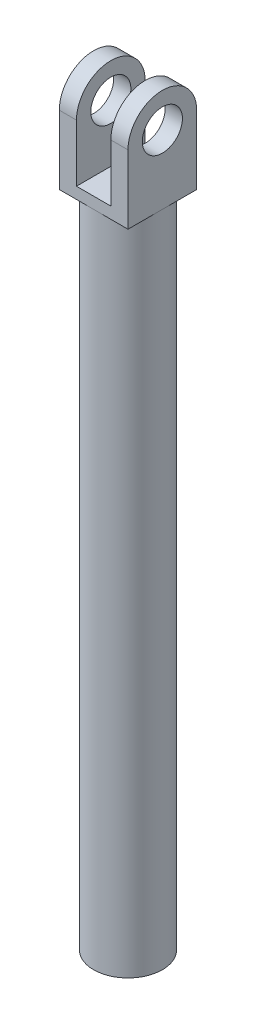
ISO-10303-21;
HEADER;
FILE_DESCRIPTION(('STEP AP214'),'2;1');
FILE_NAME('part.step','',(''),(''),'','','');
FILE_SCHEMA(('AUTOMOTIVE_DESIGN { 1 0 10303 214 1 1 1 1 }'));
ENDSEC;
DATA;
#1=APPLICATION_CONTEXT('core data for automotive mechanical design processes');
#2=APPLICATION_PROTOCOL_DEFINITION('international standard','automotive_design',2000,#1);
#3=PRODUCT_CONTEXT('',#1,'mechanical');
#4=PRODUCT('Part','Part','',(#3));
#5=PRODUCT_RELATED_PRODUCT_CATEGORY('part','',(#4));
#6=PRODUCT_DEFINITION_FORMATION('','',#4);
#7=PRODUCT_DEFINITION_CONTEXT('part definition',#1,'design');
#8=PRODUCT_DEFINITION('design','',#6,#7);
#9=PRODUCT_DEFINITION_SHAPE('','',#8);
#10=(LENGTH_UNIT() NAMED_UNIT(*) SI_UNIT(.MILLI.,.METRE.));
#11=(NAMED_UNIT(*) PLANE_ANGLE_UNIT() SI_UNIT($,.RADIAN.));
#12=(NAMED_UNIT(*) SI_UNIT($,.STERADIAN.) SOLID_ANGLE_UNIT());
#13=UNCERTAINTY_MEASURE_WITH_UNIT(LENGTH_MEASURE(1.E-05),#10,'distance_accuracy_value','');
#14=(GEOMETRIC_REPRESENTATION_CONTEXT(3) GLOBAL_UNCERTAINTY_ASSIGNED_CONTEXT((#13)) GLOBAL_UNIT_ASSIGNED_CONTEXT((#10,
#11,#12)) REPRESENTATION_CONTEXT('',''));
#15=CARTESIAN_POINT('',(0.,0.,0.));
#16=DIRECTION('',(0.,0.,1.));
#17=DIRECTION('',(1.,0.,0.));
#18=AXIS2_PLACEMENT_3D('',#15,#16,#17);
#19=CARTESIAN_POINT('',(3.,127.,0.));
#20=DIRECTION('',(1.,0.,0.));
#21=DIRECTION('',(0.,0.,-1.));
#22=AXIS2_PLACEMENT_3D('',#19,#20,#21);
#23=CYLINDRICAL_SURFACE('',#22,3.5);
#24=CARTESIAN_POINT('',(3.,127.,0.));
#25=DIRECTION('',(1.,0.,0.));
#26=DIRECTION('',(0.,0.,-1.));
#27=AXIS2_PLACEMENT_3D('',#24,#25,#26);
#28=CIRCLE('',#27,3.5);
#29=CARTESIAN_POINT('',(3.,127.,-3.5));
#30=VERTEX_POINT('',#29);
#31=EDGE_CURVE('E224',#30,#30,#28,.T.);
#32=ORIENTED_EDGE('',*,*,#31,.F.);
#33=EDGE_LOOP('',(#32));
#34=FACE_BOUND('',#33,.T.);
#35=CARTESIAN_POINT('',(6.,127.,0.));
#36=DIRECTION('',(1.,0.,0.));
#37=DIRECTION('',(0.,0.,-1.));
#38=AXIS2_PLACEMENT_3D('',#35,#36,#37);
#39=CIRCLE('',#38,3.5);
#40=CARTESIAN_POINT('',(6.,127.,-3.5));
#41=VERTEX_POINT('',#40);
#42=EDGE_CURVE('E188',#41,#41,#39,.T.);
#43=ORIENTED_EDGE('',*,*,#42,.T.);
#44=EDGE_LOOP('',(#43));
#45=FACE_BOUND('',#44,.T.);
#46=ADVANCED_FACE('F17',(#34,#45),#23,.F.);
#47=CARTESIAN_POINT('',(-6.072,0.,-6.072));
#48=DIRECTION('',(0.,1.,0.));
#49=DIRECTION('',(0.,0.,1.));
#50=AXIS2_PLACEMENT_3D('',#47,#48,#49);
#51=PLANE('',#50);
#52=CARTESIAN_POINT('',(0.,0.,0.));
#53=DIRECTION('',(0.,1.,0.));
#54=DIRECTION('',(0.,0.,1.));
#55=AXIS2_PLACEMENT_3D('',#52,#53,#54);
#56=CIRCLE('',#55,6.);
#57=CARTESIAN_POINT('',(0.,0.,6.));
#58=VERTEX_POINT('',#57);
#59=EDGE_CURVE('E176',#58,#58,#56,.F.);
#60=ORIENTED_EDGE('',*,*,#59,.T.);
#61=EDGE_LOOP('',(#60));
#62=FACE_BOUND('',#61,.T.);
#63=ADVANCED_FACE('F311',(#62),#51,.F.);
#64=CARTESIAN_POINT('',(-0.036,115.,-6.));
#65=DIRECTION('',(0.,1.,0.));
#66=DIRECTION('',(0.,0.,1.));
#67=AXIS2_PLACEMENT_3D('',#64,#65,#66);
#68=PLANE('',#67);
#69=DIRECTION('',(1.,0.,0.));
#70=VECTOR('',#69,1.);
#71=CARTESIAN_POINT('',(0.,115.,-6.));
#72=LINE('',#71,#70);
#73=CARTESIAN_POINT('',(-1.23062060560279E-09,115.,-6.));
#74=VERTEX_POINT('',#73);
#75=CARTESIAN_POINT('',(6.,115.,-6.));
#76=VERTEX_POINT('',#75);
#77=EDGE_CURVE('E126',#74,#76,#72,.T.);
#78=ORIENTED_EDGE('',*,*,#77,.T.);
#79=DIRECTION('',(0.,0.,1.));
#80=VECTOR('',#79,1.);
#81=CARTESIAN_POINT('',(6.,115.,0.));
#82=LINE('',#81,#80);
#83=CARTESIAN_POINT('',(6.,115.,-6.15309619412179E-10));
#84=VERTEX_POINT('',#83);
#85=EDGE_CURVE('E208',#76,#84,#82,.T.);
#86=ORIENTED_EDGE('',*,*,#85,.T.);
#87=CARTESIAN_POINT('',(0.,115.,0.));
#88=DIRECTION('',(0.,1.,0.));
#89=DIRECTION('',(0.,0.,1.));
#90=AXIS2_PLACEMENT_3D('',#87,#88,#89);
#91=CIRCLE('',#90,6.);
#92=EDGE_CURVE('E21',#74,#84,#91,.F.);
#93=ORIENTED_EDGE('',*,*,#92,.F.);
#94=EDGE_LOOP('',(#78,#86,#93));
#95=FACE_BOUND('',#94,.T.);
#96=ADVANCED_FACE('F231',(#95),#68,.F.);
#97=CARTESIAN_POINT('',(3.,117.,-6.));
#98=DIRECTION('',(-1.,0.,0.));
#99=DIRECTION('',(0.,0.,1.));
#100=AXIS2_PLACEMENT_3D('',#97,#98,#99);
#101=PLANE('',#100);
#102=ORIENTED_EDGE('',*,*,#31,.T.);
#103=EDGE_LOOP('',(#102));
#104=FACE_BOUND('',#103,.T.);
#105=DIRECTION('',(0.,1.,0.));
#106=VECTOR('',#105,1.);
#107=CARTESIAN_POINT('',(3.,121.,6.));
#108=LINE('',#107,#106);
#109=CARTESIAN_POINT('',(3.,117.000000002667,6.));
#110=VERTEX_POINT('',#109);
#111=CARTESIAN_POINT('',(3.,127.,6.));
#112=VERTEX_POINT('',#111);
#113=EDGE_CURVE('E150',#110,#112,#108,.T.);
#114=ORIENTED_EDGE('',*,*,#113,.T.);
#115=CARTESIAN_POINT('',(3.,127.,0.));
#116=DIRECTION('',(1.,0.,0.));
#117=DIRECTION('',(0.,0.,-1.));
#118=AXIS2_PLACEMENT_3D('',#115,#116,#117);
#119=CIRCLE('',#118,6.);
#120=CARTESIAN_POINT('',(3.,127.,-6.));
#121=VERTEX_POINT('',#120);
#122=EDGE_CURVE('E223',#112,#121,#119,.F.);
#123=ORIENTED_EDGE('',*,*,#122,.T.);
#124=DIRECTION('',(0.,-1.,0.));
#125=VECTOR('',#124,1.);
#126=CARTESIAN_POINT('',(3.,121.,-6.));
#127=LINE('',#126,#125);
#128=CARTESIAN_POINT('',(3.,117.000000002,-6.));
#129=VERTEX_POINT('',#128);
#130=EDGE_CURVE('E154',#121,#129,#127,.T.);
#131=ORIENTED_EDGE('',*,*,#130,.T.);
#132=DIRECTION('',(0.,0.,-1.));
#133=VECTOR('',#132,1.);
#134=CARTESIAN_POINT('',(3.,117.,0.));
#135=LINE('',#134,#133);
#136=EDGE_CURVE('E167',#110,#129,#135,.T.);
#137=ORIENTED_EDGE('',*,*,#136,.F.);
#138=EDGE_LOOP('',(#114,#123,#131,#137));
#139=FACE_BOUND('',#138,.T.);
#140=ADVANCED_FACE('F246',(#104,#139),#101,.T.);
#141=CARTESIAN_POINT('',(3.,127.,0.));
#142=DIRECTION('',(1.,0.,0.));
#143=DIRECTION('',(0.,0.,-1.));
#144=AXIS2_PLACEMENT_3D('',#141,#142,#143);
#145=CYLINDRICAL_SURFACE('',#144,6.);
#146=DIRECTION('',(-1.,0.,0.));
#147=VECTOR('',#146,1.);
#148=CARTESIAN_POINT('',(0.,127.,-6.));
#149=LINE('',#148,#147);
#150=CARTESIAN_POINT('',(6.,127.,-6.));
#151=VERTEX_POINT('',#150);
#152=EDGE_CURVE('E199',#151,#121,#149,.T.);
#153=ORIENTED_EDGE('',*,*,#152,.T.);
#154=ORIENTED_EDGE('',*,*,#122,.F.);
#155=DIRECTION('',(1.,0.,0.));
#156=VECTOR('',#155,1.);
#157=CARTESIAN_POINT('',(0.,127.,6.));
#158=LINE('',#157,#156);
#159=CARTESIAN_POINT('',(6.,127.,6.));
#160=VERTEX_POINT('',#159);
#161=EDGE_CURVE('E181',#112,#160,#158,.T.);
#162=ORIENTED_EDGE('',*,*,#161,.T.);
#163=CARTESIAN_POINT('',(6.,127.,0.));
#164=DIRECTION('',(1.,0.,0.));
#165=DIRECTION('',(0.,0.,-1.));
#166=AXIS2_PLACEMENT_3D('',#163,#164,#165);
#167=CIRCLE('',#166,6.);
#168=EDGE_CURVE('E210',#160,#151,#167,.F.);
#169=ORIENTED_EDGE('',*,*,#168,.T.);
#170=EDGE_LOOP('',(#153,#154,#162,#169));
#171=FACE_BOUND('',#170,.T.);
#172=ADVANCED_FACE('F242',(#171),#145,.T.);
#173=CARTESIAN_POINT('',(6.,115.,-6.));
#174=DIRECTION('',(-1.,0.,0.));
#175=DIRECTION('',(0.,0.,1.));
#176=AXIS2_PLACEMENT_3D('',#173,#174,#175);
#177=PLANE('',#176);
#178=ORIENTED_EDGE('',*,*,#42,.F.);
#179=EDGE_LOOP('',(#178));
#180=FACE_BOUND('',#179,.T.);
#181=ORIENTED_EDGE('',*,*,#85,.F.);
#182=DIRECTION('',(0.,1.,0.));
#183=VECTOR('',#182,1.);
#184=CARTESIAN_POINT('',(6.,121.,-6.));
#185=LINE('',#184,#183);
#186=EDGE_CURVE('E166',#76,#151,#185,.T.);
#187=ORIENTED_EDGE('',*,*,#186,.T.);
#188=ORIENTED_EDGE('',*,*,#168,.F.);
#189=DIRECTION('',(0.,-1.,0.));
#190=VECTOR('',#189,1.);
#191=CARTESIAN_POINT('',(6.,121.,6.));
#192=LINE('',#191,#190);
#193=CARTESIAN_POINT('',(6.,115.,6.));
#194=VERTEX_POINT('',#193);
#195=EDGE_CURVE('E172',#160,#194,#192,.T.);
#196=ORIENTED_EDGE('',*,*,#195,.T.);
#197=DIRECTION('',(0.,0.,-1.));
#198=VECTOR('',#197,1.);
#199=CARTESIAN_POINT('',(6.,115.,2.982));
#200=LINE('',#199,#198);
#201=EDGE_CURVE('E184',#194,#84,#200,.T.);
#202=ORIENTED_EDGE('',*,*,#201,.T.);
#203=EDGE_LOOP('',(#181,#187,#188,#196,#202));
#204=FACE_BOUND('',#203,.T.);
#205=ADVANCED_FACE('F237',(#180,#204),#177,.F.);
#206=CARTESIAN_POINT('',(-0.036,115.,-0.036));
#207=DIRECTION('',(0.,1.,0.));
#208=DIRECTION('',(0.,0.,1.));
#209=AXIS2_PLACEMENT_3D('',#206,#207,#208);
#210=PLANE('',#209);
#211=ORIENTED_EDGE('',*,*,#201,.F.);
#212=DIRECTION('',(-1.,0.,0.));
#213=VECTOR('',#212,1.);
#214=CARTESIAN_POINT('',(0.,115.,6.));
#215=LINE('',#214,#213);
#216=CARTESIAN_POINT('',(-5.38761770572398E-10,115.,6.));
#217=VERTEX_POINT('',#216);
#218=EDGE_CURVE('E147',#194,#217,#215,.T.);
#219=ORIENTED_EDGE('',*,*,#218,.T.);
#220=CARTESIAN_POINT('',(0.,115.,0.));
#221=DIRECTION('',(0.,1.,0.));
#222=DIRECTION('',(0.,0.,1.));
#223=AXIS2_PLACEMENT_3D('',#220,#221,#222);
#224=CIRCLE('',#223,6.);
#225=EDGE_CURVE('E187',#84,#217,#224,.F.);
#226=ORIENTED_EDGE('',*,*,#225,.F.);
#227=EDGE_LOOP('',(#211,#219,#226));
#228=FACE_BOUND('',#227,.T.);
#229=ADVANCED_FACE('F234',(#228),#210,.F.);
#230=CARTESIAN_POINT('',(0.,0.,0.));
#231=DIRECTION('',(0.,1.,0.));
#232=DIRECTION('',(0.,0.,1.));
#233=AXIS2_PLACEMENT_3D('',#230,#231,#232);
#234=CYLINDRICAL_SURFACE('',#233,6.);
#235=ORIENTED_EDGE('',*,*,#59,.F.);
#236=EDGE_LOOP('',(#235));
#237=FACE_BOUND('',#236,.T.);
#238=ORIENTED_EDGE('',*,*,#225,.T.);
#239=CARTESIAN_POINT('',(0.,115.,0.));
#240=DIRECTION('',(0.,1.,0.));
#241=DIRECTION('',(0.,0.,1.));
#242=AXIS2_PLACEMENT_3D('',#239,#240,#241);
#243=CIRCLE('',#242,6.);
#244=CARTESIAN_POINT('',(-6.,115.,-1.15406939158313E-09));
#245=VERTEX_POINT('',#244);
#246=EDGE_CURVE('E127',#217,#245,#243,.F.);
#247=ORIENTED_EDGE('',*,*,#246,.T.);
#248=CARTESIAN_POINT('',(0.,115.,0.));
#249=DIRECTION('',(0.,1.,0.));
#250=DIRECTION('',(0.,0.,1.));
#251=AXIS2_PLACEMENT_3D('',#248,#249,#250);
#252=CIRCLE('',#251,6.);
#253=EDGE_CURVE('E36',#245,#74,#252,.F.);
#254=ORIENTED_EDGE('',*,*,#253,.T.);
#255=ORIENTED_EDGE('',*,*,#92,.T.);
#256=EDGE_LOOP('',(#238,#247,#254,#255));
#257=FACE_BOUND('',#256,.T.);
#258=ADVANCED_FACE('F229',(#237,#257),#234,.T.);
#259=CARTESIAN_POINT('',(-3.,117.,-6.));
#260=DIRECTION('',(0.,1.,0.));
#261=DIRECTION('',(0.,0.,1.));
#262=AXIS2_PLACEMENT_3D('',#259,#260,#261);
#263=PLANE('',#262);
#264=ORIENTED_EDGE('',*,*,#136,.T.);
#265=DIRECTION('',(-1.,0.,0.));
#266=VECTOR('',#265,1.);
#267=CARTESIAN_POINT('',(0.,117.000000004,-6.));
#268=LINE('',#267,#266);
#269=CARTESIAN_POINT('',(-3.,117.000000001333,-6.));
#270=VERTEX_POINT('',#269);
#271=EDGE_CURVE('E151',#129,#270,#268,.T.);
#272=ORIENTED_EDGE('',*,*,#271,.T.);
#273=DIRECTION('',(0.,0.,-1.));
#274=VECTOR('',#273,1.);
#275=CARTESIAN_POINT('',(-3.,117.,0.));
#276=LINE('',#275,#274);
#277=CARTESIAN_POINT('',(-3.,117.000000001333,6.));
#278=VERTEX_POINT('',#277);
#279=EDGE_CURVE('E157',#278,#270,#276,.T.);
#280=ORIENTED_EDGE('',*,*,#279,.F.);
#281=DIRECTION('',(1.,0.,0.));
#282=VECTOR('',#281,1.);
#283=CARTESIAN_POINT('',(0.,117.000000004,6.));
#284=LINE('',#283,#282);
#285=EDGE_CURVE('E85',#278,#110,#284,.T.);
#286=ORIENTED_EDGE('',*,*,#285,.T.);
#287=EDGE_LOOP('',(#264,#272,#280,#286));
#288=FACE_BOUND('',#287,.T.);
#289=ADVANCED_FACE('F251',(#288),#263,.T.);
#290=CARTESIAN_POINT('',(-6.,115.,-6.));
#291=DIRECTION('',(0.,0.,1.));
#292=DIRECTION('',(1.,0.,0.));
#293=AXIS2_PLACEMENT_3D('',#290,#291,#292);
#294=PLANE('',#293);
#295=DIRECTION('',(0.,1.,0.));
#296=VECTOR('',#295,1.);
#297=CARTESIAN_POINT('',(-6.,124.054,-6.));
#298=LINE('',#297,#296);
#299=CARTESIAN_POINT('',(-6.,115.,-6.));
#300=VERTEX_POINT('',#299);
#301=CARTESIAN_POINT('',(-6.,126.999999998769,-6.));
#302=VERTEX_POINT('',#301);
#303=EDGE_CURVE('E113',#300,#302,#298,.T.);
#304=ORIENTED_EDGE('',*,*,#303,.T.);
#305=DIRECTION('',(-1.,0.,0.));
#306=VECTOR('',#305,1.);
#307=CARTESIAN_POINT('',(-4.5,126.999999997539,-6.));
#308=LINE('',#307,#306);
#309=CARTESIAN_POINT('',(-3.,126.999999998769,-6.));
#310=VERTEX_POINT('',#309);
#311=EDGE_CURVE('E148',#302,#310,#308,.F.);
#312=ORIENTED_EDGE('',*,*,#311,.T.);
#313=DIRECTION('',(0.,1.,0.));
#314=VECTOR('',#313,1.);
#315=CARTESIAN_POINT('',(-3.,125.048,-6.));
#316=LINE('',#315,#314);
#317=EDGE_CURVE('E106',#270,#310,#316,.T.);
#318=ORIENTED_EDGE('',*,*,#317,.F.);
#319=ORIENTED_EDGE('',*,*,#271,.F.);
#320=ORIENTED_EDGE('',*,*,#130,.F.);
#321=ORIENTED_EDGE('',*,*,#152,.F.);
#322=ORIENTED_EDGE('',*,*,#186,.F.);
#323=ORIENTED_EDGE('',*,*,#77,.F.);
#324=DIRECTION('',(-1.,0.,0.));
#325=VECTOR('',#324,1.);
#326=CARTESIAN_POINT('',(-2.982,115.,-6.));
#327=LINE('',#326,#325);
#328=EDGE_CURVE('E123',#74,#300,#327,.T.);
#329=ORIENTED_EDGE('',*,*,#328,.T.);
#330=EDGE_LOOP('',(#304,#312,#318,#319,#320,#321,#322,#323,#329));
#331=FACE_BOUND('',#330,.T.);
#332=ADVANCED_FACE('F124',(#331),#294,.F.);
#333=CARTESIAN_POINT('',(-3.,127.,0.));
#334=DIRECTION('',(-1.,0.,0.));
#335=DIRECTION('',(0.,0.,1.));
#336=AXIS2_PLACEMENT_3D('',#333,#334,#335);
#337=CYLINDRICAL_SURFACE('',#336,6.);
#338=DIRECTION('',(1.,0.,0.));
#339=VECTOR('',#338,1.);
#340=CARTESIAN_POINT('',(0.,127.,6.));
#341=LINE('',#340,#339);
#342=CARTESIAN_POINT('',(-6.,127.,6.));
#343=VERTEX_POINT('',#342);
#344=CARTESIAN_POINT('',(-3.,127.,6.));
#345=VERTEX_POINT('',#344);
#346=EDGE_CURVE('E76',#343,#345,#341,.T.);
#347=ORIENTED_EDGE('',*,*,#346,.T.);
#348=CARTESIAN_POINT('',(-3.,127.,0.));
#349=DIRECTION('',(-1.,0.,0.));
#350=DIRECTION('',(0.,0.,1.));
#351=AXIS2_PLACEMENT_3D('',#348,#349,#350);
#352=CIRCLE('',#351,6.);
#353=EDGE_CURVE('E121',#310,#345,#352,.F.);
#354=ORIENTED_EDGE('',*,*,#353,.F.);
#355=ORIENTED_EDGE('',*,*,#311,.F.);
#356=CARTESIAN_POINT('',(-6.,127.,0.));
#357=DIRECTION('',(-1.,0.,0.));
#358=DIRECTION('',(0.,0.,1.));
#359=AXIS2_PLACEMENT_3D('',#356,#357,#358);
#360=CIRCLE('',#359,6.);
#361=EDGE_CURVE('E119',#302,#343,#360,.F.);
#362=ORIENTED_EDGE('',*,*,#361,.T.);
#363=EDGE_LOOP('',(#347,#354,#355,#362));
#364=FACE_BOUND('',#363,.T.);
#365=ADVANCED_FACE('F267',(#364),#337,.T.);
#366=CARTESIAN_POINT('',(6.,115.,6.));
#367=DIRECTION('',(0.,0.,-1.));
#368=DIRECTION('',(-1.,0.,0.));
#369=AXIS2_PLACEMENT_3D('',#366,#367,#368);
#370=PLANE('',#369);
#371=DIRECTION('',(0.,-1.,0.));
#372=VECTOR('',#371,1.);
#373=CARTESIAN_POINT('',(-3.,125.048,6.));
#374=LINE('',#373,#372);
#375=EDGE_CURVE('E159',#345,#278,#374,.T.);
#376=ORIENTED_EDGE('',*,*,#375,.F.);
#377=ORIENTED_EDGE('',*,*,#346,.F.);
#378=DIRECTION('',(0.,-1.,0.));
#379=VECTOR('',#378,1.);
#380=CARTESIAN_POINT('',(-6.,124.054,6.));
#381=LINE('',#380,#379);
#382=CARTESIAN_POINT('',(-6.,115.,6.));
#383=VERTEX_POINT('',#382);
#384=EDGE_CURVE('E134',#343,#383,#381,.T.);
#385=ORIENTED_EDGE('',*,*,#384,.T.);
#386=DIRECTION('',(1.,0.,0.));
#387=VECTOR('',#386,1.);
#388=CARTESIAN_POINT('',(-2.982,115.,6.));
#389=LINE('',#388,#387);
#390=EDGE_CURVE('E141',#383,#217,#389,.T.);
#391=ORIENTED_EDGE('',*,*,#390,.T.);
#392=ORIENTED_EDGE('',*,*,#218,.F.);
#393=ORIENTED_EDGE('',*,*,#195,.F.);
#394=ORIENTED_EDGE('',*,*,#161,.F.);
#395=ORIENTED_EDGE('',*,*,#113,.F.);
#396=ORIENTED_EDGE('',*,*,#285,.F.);
#397=EDGE_LOOP('',(#376,#377,#385,#391,#392,#393,#394,#395,#396));
#398=FACE_BOUND('',#397,.T.);
#399=ADVANCED_FACE('F240',(#398),#370,.F.);
#400=CARTESIAN_POINT('',(-6.,115.,-0.036));
#401=DIRECTION('',(0.,1.,0.));
#402=DIRECTION('',(0.,0.,1.));
#403=AXIS2_PLACEMENT_3D('',#400,#401,#402);
#404=PLANE('',#403);
#405=ORIENTED_EDGE('',*,*,#390,.F.);
#406=DIRECTION('',(0.,0.,-1.));
#407=VECTOR('',#406,1.);
#408=CARTESIAN_POINT('',(-6.,115.,0.));
#409=LINE('',#408,#407);
#410=EDGE_CURVE('E130',#383,#245,#409,.T.);
#411=ORIENTED_EDGE('',*,*,#410,.T.);
#412=ORIENTED_EDGE('',*,*,#246,.F.);
#413=EDGE_LOOP('',(#405,#411,#412));
#414=FACE_BOUND('',#413,.T.);
#415=ADVANCED_FACE('F275',(#414),#404,.F.);
#416=CARTESIAN_POINT('',(-6.,115.,-6.));
#417=DIRECTION('',(0.,1.,0.));
#418=DIRECTION('',(0.,0.,1.));
#419=AXIS2_PLACEMENT_3D('',#416,#417,#418);
#420=PLANE('',#419);
#421=DIRECTION('',(0.,0.,-1.));
#422=VECTOR('',#421,1.);
#423=CARTESIAN_POINT('',(-6.,115.,0.));
#424=LINE('',#423,#422);
#425=EDGE_CURVE('E116',#245,#300,#424,.T.);
#426=ORIENTED_EDGE('',*,*,#425,.T.);
#427=ORIENTED_EDGE('',*,*,#328,.F.);
#428=ORIENTED_EDGE('',*,*,#253,.F.);
#429=EDGE_LOOP('',(#426,#427,#428));
#430=FACE_BOUND('',#429,.T.);
#431=ADVANCED_FACE('F129',(#430),#420,.F.);
#432=CARTESIAN_POINT('',(-3.,133.096,-6.));
#433=DIRECTION('',(1.,0.,0.));
#434=DIRECTION('',(0.,0.,1.));
#435=AXIS2_PLACEMENT_3D('',#432,#433,#434);
#436=PLANE('',#435);
#437=CARTESIAN_POINT('',(-3.,127.,0.));
#438=DIRECTION('',(-1.,0.,0.));
#439=DIRECTION('',(0.,0.,1.));
#440=AXIS2_PLACEMENT_3D('',#437,#438,#439);
#441=CIRCLE('',#440,3.5);
#442=CARTESIAN_POINT('',(-3.,127.,3.5));
#443=VERTEX_POINT('',#442);
#444=EDGE_CURVE('E27',#443,#443,#441,.F.);
#445=ORIENTED_EDGE('',*,*,#444,.F.);
#446=EDGE_LOOP('',(#445));
#447=FACE_BOUND('',#446,.T.);
#448=ORIENTED_EDGE('',*,*,#317,.T.);
#449=ORIENTED_EDGE('',*,*,#353,.T.);
#450=ORIENTED_EDGE('',*,*,#375,.T.);
#451=ORIENTED_EDGE('',*,*,#279,.T.);
#452=EDGE_LOOP('',(#448,#449,#450,#451));
#453=FACE_BOUND('',#452,.T.);
#454=ADVANCED_FACE('F252',(#447,#453),#436,.T.);
#455=CARTESIAN_POINT('',(-6.,115.,6.));
#456=DIRECTION('',(1.,0.,0.));
#457=DIRECTION('',(0.,0.,-1.));
#458=AXIS2_PLACEMENT_3D('',#455,#456,#457);
#459=PLANE('',#458);
#460=CARTESIAN_POINT('',(-6.,127.,0.));
#461=DIRECTION('',(-1.,0.,0.));
#462=DIRECTION('',(0.,0.,1.));
#463=AXIS2_PLACEMENT_3D('',#460,#461,#462);
#464=CIRCLE('',#463,3.5);
#465=CARTESIAN_POINT('',(-6.,127.,3.5));
#466=VERTEX_POINT('',#465);
#467=EDGE_CURVE('E11',#466,#466,#464,.T.);
#468=ORIENTED_EDGE('',*,*,#467,.F.);
#469=EDGE_LOOP('',(#468));
#470=FACE_BOUND('',#469,.T.);
#471=ORIENTED_EDGE('',*,*,#410,.F.);
#472=ORIENTED_EDGE('',*,*,#384,.F.);
#473=ORIENTED_EDGE('',*,*,#361,.F.);
#474=ORIENTED_EDGE('',*,*,#303,.F.);
#475=ORIENTED_EDGE('',*,*,#425,.F.);
#476=EDGE_LOOP('',(#471,#472,#473,#474,#475));
#477=FACE_BOUND('',#476,.T.);
#478=ADVANCED_FACE('F19',(#470,#477),#459,.F.);
#479=CARTESIAN_POINT('',(-3.,127.,0.));
#480=DIRECTION('',(-1.,0.,0.));
#481=DIRECTION('',(0.,0.,1.));
#482=AXIS2_PLACEMENT_3D('',#479,#480,#481);
#483=CYLINDRICAL_SURFACE('',#482,3.5);
#484=ORIENTED_EDGE('',*,*,#467,.T.);
#485=EDGE_LOOP('',(#484));
#486=FACE_BOUND('',#485,.T.);
#487=ORIENTED_EDGE('',*,*,#444,.T.);
#488=EDGE_LOOP('',(#487));
#489=FACE_BOUND('',#488,.T.);
#490=ADVANCED_FACE('F280',(#486,#489),#483,.F.);
#491=CLOSED_SHELL('',(#46,#63,#96,#140,#172,#205,#229,#258,#289,#332,#365,#399,#415,#431,#454,
#478,#490));
#492=MANIFOLD_SOLID_BREP('B1',#491);
#493=ADVANCED_BREP_SHAPE_REPRESENTATION('',(#18,#492),#14);
#494=SHAPE_DEFINITION_REPRESENTATION(#9,#493);
ENDSEC;
END-ISO-10303-21;
